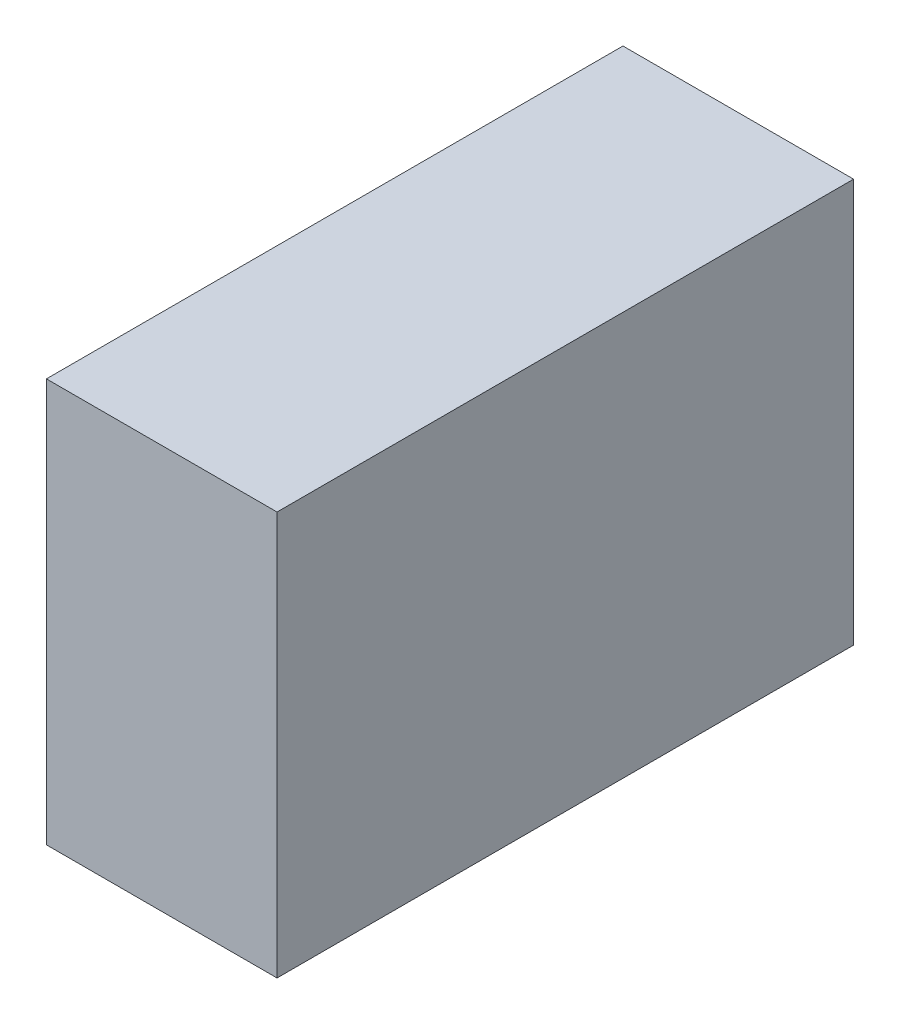
ISO-10303-21;
HEADER;
FILE_DESCRIPTION(('STEP AP214'),'2;1');
FILE_NAME('part.step','',(''),(''),'','','');
FILE_SCHEMA(('AUTOMOTIVE_DESIGN { 1 0 10303 214 1 1 1 1 }'));
ENDSEC;
DATA;
#1=APPLICATION_CONTEXT('core data for automotive mechanical design processes');
#2=APPLICATION_PROTOCOL_DEFINITION('international standard','automotive_design',2000,#1);
#3=PRODUCT_CONTEXT('',#1,'mechanical');
#4=PRODUCT('Part','Part','',(#3));
#5=PRODUCT_RELATED_PRODUCT_CATEGORY('part','',(#4));
#6=PRODUCT_DEFINITION_FORMATION('','',#4);
#7=PRODUCT_DEFINITION_CONTEXT('part definition',#1,'design');
#8=PRODUCT_DEFINITION('design','',#6,#7);
#9=PRODUCT_DEFINITION_SHAPE('','',#8);
#10=(LENGTH_UNIT() NAMED_UNIT(*) SI_UNIT(.MILLI.,.METRE.));
#11=(NAMED_UNIT(*) PLANE_ANGLE_UNIT() SI_UNIT($,.RADIAN.));
#12=(NAMED_UNIT(*) SI_UNIT($,.STERADIAN.) SOLID_ANGLE_UNIT());
#13=UNCERTAINTY_MEASURE_WITH_UNIT(LENGTH_MEASURE(1.E-05),#10,'distance_accuracy_value','');
#14=(GEOMETRIC_REPRESENTATION_CONTEXT(3) GLOBAL_UNCERTAINTY_ASSIGNED_CONTEXT((#13)) GLOBAL_UNIT_ASSIGNED_CONTEXT((#10,
#11,#12)) REPRESENTATION_CONTEXT('',''));
#15=CARTESIAN_POINT('',(0.,0.,0.));
#16=DIRECTION('',(0.,0.,1.));
#17=DIRECTION('',(1.,0.,0.));
#18=AXIS2_PLACEMENT_3D('',#15,#16,#17);
#19=CARTESIAN_POINT('',(10.,-17.5,50.));
#20=DIRECTION('',(-1.,0.,0.));
#21=DIRECTION('',(0.,0.,1.));
#22=AXIS2_PLACEMENT_3D('',#19,#20,#21);
#23=PLANE('',#22);
#24=DIRECTION('',(0.,1.,0.));
#25=VECTOR('',#24,1.);
#26=CARTESIAN_POINT('',(10.,-17.5,0.));
#27=LINE('',#26,#25);
#28=CARTESIAN_POINT('',(10.,-17.5,0.));
#29=VERTEX_POINT('',#28);
#30=CARTESIAN_POINT('',(10.,17.5,0.));
#31=VERTEX_POINT('',#30);
#32=EDGE_CURVE('E111',#29,#31,#27,.T.);
#33=ORIENTED_EDGE('',*,*,#32,.T.);
#34=DIRECTION('',(0.,0.,-1.));
#35=VECTOR('',#34,1.);
#36=CARTESIAN_POINT('',(10.,17.5,50.));
#37=LINE('',#36,#35);
#38=CARTESIAN_POINT('',(10.,17.5,50.));
#39=VERTEX_POINT('',#38);
#40=EDGE_CURVE('E11',#39,#31,#37,.T.);
#41=ORIENTED_EDGE('',*,*,#40,.F.);
#42=DIRECTION('',(0.,1.,0.));
#43=VECTOR('',#42,1.);
#44=CARTESIAN_POINT('',(10.,-17.5,50.));
#45=LINE('',#44,#43);
#46=CARTESIAN_POINT('',(10.,-17.5,50.));
#47=VERTEX_POINT('',#46);
#48=EDGE_CURVE('E95',#47,#39,#45,.T.);
#49=ORIENTED_EDGE('',*,*,#48,.F.);
#50=DIRECTION('',(0.,0.,-1.));
#51=VECTOR('',#50,1.);
#52=CARTESIAN_POINT('',(10.,-17.5,50.));
#53=LINE('',#52,#51);
#54=EDGE_CURVE('E107',#47,#29,#53,.T.);
#55=ORIENTED_EDGE('',*,*,#54,.T.);
#56=EDGE_LOOP('',(#33,#41,#49,#55));
#57=FACE_BOUND('',#56,.T.);
#58=ADVANCED_FACE('F43',(#57),#23,.F.);
#59=CARTESIAN_POINT('',(-10.,17.5,50.));
#60=DIRECTION('',(0.,-1.,0.));
#61=DIRECTION('',(0.,0.,-1.));
#62=AXIS2_PLACEMENT_3D('',#59,#60,#61);
#63=PLANE('',#62);
#64=DIRECTION('',(-1.,0.,0.));
#65=VECTOR('',#64,1.);
#66=CARTESIAN_POINT('',(-10.,17.5,0.));
#67=LINE('',#66,#65);
#68=CARTESIAN_POINT('',(-10.,17.5,0.));
#69=VERTEX_POINT('',#68);
#70=EDGE_CURVE('E100',#31,#69,#67,.T.);
#71=ORIENTED_EDGE('',*,*,#70,.T.);
#72=DIRECTION('',(0.,0.,-1.));
#73=VECTOR('',#72,1.);
#74=CARTESIAN_POINT('',(-10.,17.5,50.));
#75=LINE('',#74,#73);
#76=CARTESIAN_POINT('',(-10.,17.5,50.));
#77=VERTEX_POINT('',#76);
#78=EDGE_CURVE('E52',#77,#69,#75,.T.);
#79=ORIENTED_EDGE('',*,*,#78,.F.);
#80=DIRECTION('',(-1.,0.,0.));
#81=VECTOR('',#80,1.);
#82=CARTESIAN_POINT('',(-10.,17.5,50.));
#83=LINE('',#82,#81);
#84=EDGE_CURVE('E90',#39,#77,#83,.T.);
#85=ORIENTED_EDGE('',*,*,#84,.F.);
#86=ORIENTED_EDGE('',*,*,#40,.T.);
#87=EDGE_LOOP('',(#71,#79,#85,#86));
#88=FACE_BOUND('',#87,.T.);
#89=ADVANCED_FACE('F99',(#88),#63,.F.);
#90=CARTESIAN_POINT('',(-10.,-17.5,50.));
#91=DIRECTION('',(1.,0.,0.));
#92=DIRECTION('',(0.,0.,-1.));
#93=AXIS2_PLACEMENT_3D('',#90,#91,#92);
#94=PLANE('',#93);
#95=DIRECTION('',(0.,-1.,0.));
#96=VECTOR('',#95,1.);
#97=CARTESIAN_POINT('',(-10.,-17.5,0.));
#98=LINE('',#97,#96);
#99=CARTESIAN_POINT('',(-10.,-17.5,0.));
#100=VERTEX_POINT('',#99);
#101=EDGE_CURVE('E77',#69,#100,#98,.T.);
#102=ORIENTED_EDGE('',*,*,#101,.T.);
#103=DIRECTION('',(0.,0.,-1.));
#104=VECTOR('',#103,1.);
#105=CARTESIAN_POINT('',(-10.,-17.5,50.));
#106=LINE('',#105,#104);
#107=CARTESIAN_POINT('',(-10.,-17.5,50.));
#108=VERTEX_POINT('',#107);
#109=EDGE_CURVE('E102',#108,#100,#106,.T.);
#110=ORIENTED_EDGE('',*,*,#109,.F.);
#111=DIRECTION('',(0.,-1.,0.));
#112=VECTOR('',#111,1.);
#113=CARTESIAN_POINT('',(-10.,-17.5,50.));
#114=LINE('',#113,#112);
#115=EDGE_CURVE('E93',#77,#108,#114,.T.);
#116=ORIENTED_EDGE('',*,*,#115,.F.);
#117=ORIENTED_EDGE('',*,*,#78,.T.);
#118=EDGE_LOOP('',(#102,#110,#116,#117));
#119=FACE_BOUND('',#118,.T.);
#120=ADVANCED_FACE('F103',(#119),#94,.F.);
#121=CARTESIAN_POINT('',(-10.,-17.5,50.));
#122=DIRECTION('',(0.,1.,0.));
#123=DIRECTION('',(0.,0.,1.));
#124=AXIS2_PLACEMENT_3D('',#121,#122,#123);
#125=PLANE('',#124);
#126=DIRECTION('',(1.,0.,0.));
#127=VECTOR('',#126,1.);
#128=CARTESIAN_POINT('',(-10.,-17.5,0.));
#129=LINE('',#128,#127);
#130=EDGE_CURVE('E83',#100,#29,#129,.T.);
#131=ORIENTED_EDGE('',*,*,#130,.T.);
#132=ORIENTED_EDGE('',*,*,#54,.F.);
#133=DIRECTION('',(1.,0.,0.));
#134=VECTOR('',#133,1.);
#135=CARTESIAN_POINT('',(-10.,-17.5,50.));
#136=LINE('',#135,#134);
#137=EDGE_CURVE('E60',#108,#47,#136,.T.);
#138=ORIENTED_EDGE('',*,*,#137,.F.);
#139=ORIENTED_EDGE('',*,*,#109,.T.);
#140=EDGE_LOOP('',(#131,#132,#138,#139));
#141=FACE_BOUND('',#140,.T.);
#142=ADVANCED_FACE('F124',(#141),#125,.F.);
#143=CARTESIAN_POINT('',(0.,0.,50.));
#144=DIRECTION('',(0.,0.,-1.));
#145=DIRECTION('',(-1.,0.,0.));
#146=AXIS2_PLACEMENT_3D('',#143,#144,#145);
#147=PLANE('',#146);
#148=ORIENTED_EDGE('',*,*,#48,.T.);
#149=ORIENTED_EDGE('',*,*,#84,.T.);
#150=ORIENTED_EDGE('',*,*,#115,.T.);
#151=ORIENTED_EDGE('',*,*,#137,.T.);
#152=EDGE_LOOP('',(#148,#149,#150,#151));
#153=FACE_BOUND('',#152,.T.);
#154=ADVANCED_FACE('F91',(#153),#147,.F.);
#155=CARTESIAN_POINT('',(0.,0.,0.));
#156=DIRECTION('',(0.,0.,-1.));
#157=DIRECTION('',(-1.,0.,0.));
#158=AXIS2_PLACEMENT_3D('',#155,#156,#157);
#159=PLANE('',#158);
#160=ORIENTED_EDGE('',*,*,#32,.F.);
#161=ORIENTED_EDGE('',*,*,#130,.F.);
#162=ORIENTED_EDGE('',*,*,#101,.F.);
#163=ORIENTED_EDGE('',*,*,#70,.F.);
#164=EDGE_LOOP('',(#160,#161,#162,#163));
#165=FACE_BOUND('',#164,.T.);
#166=ADVANCED_FACE('F127',(#165),#159,.T.);
#167=CLOSED_SHELL('',(#58,#89,#120,#142,#154,#166));
#168=MANIFOLD_SOLID_BREP('B2',#167);
#169=ADVANCED_BREP_SHAPE_REPRESENTATION('',(#18,#168),#14);
#170=SHAPE_DEFINITION_REPRESENTATION(#9,#169);
ENDSEC;
END-ISO-10303-21;
